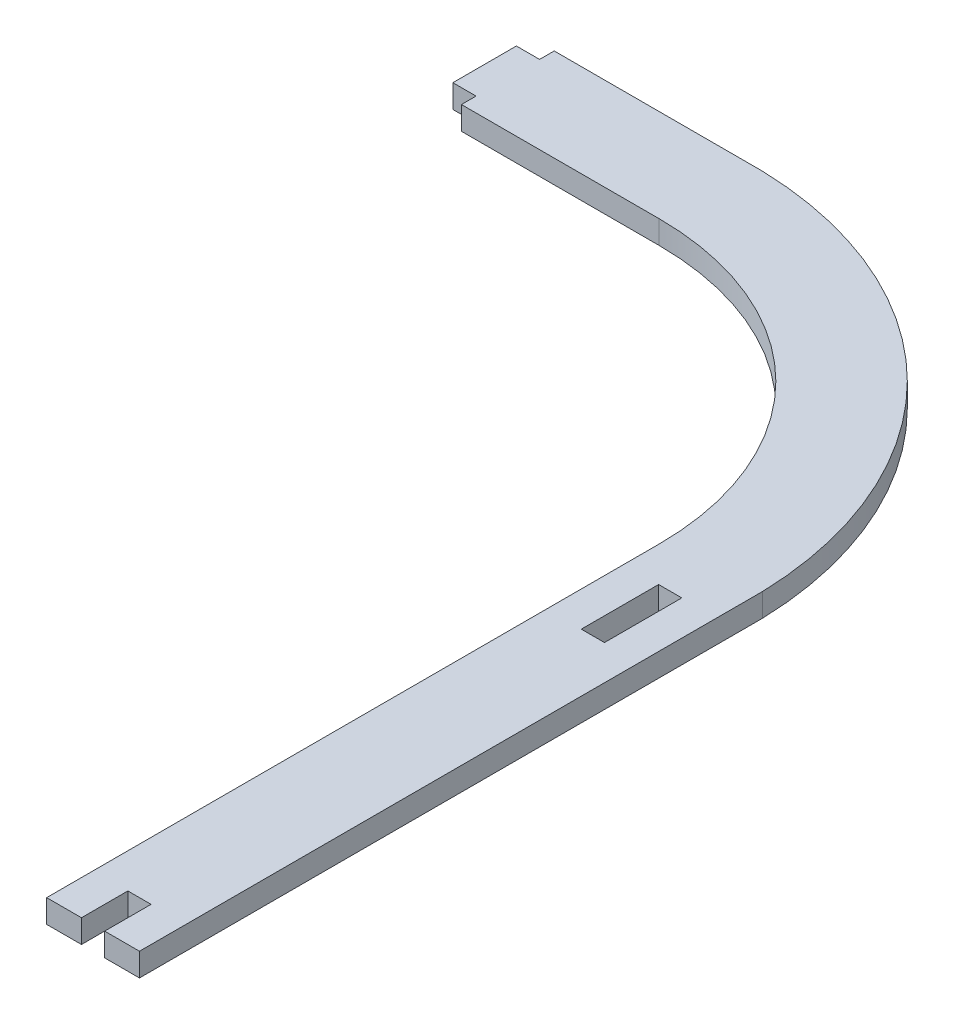
ISO-10303-21;
HEADER;
FILE_DESCRIPTION(('STEP AP214'),'2;1');
FILE_NAME('part.step','',(''),(''),'','','');
FILE_SCHEMA(('AUTOMOTIVE_DESIGN { 1 0 10303 214 1 1 1 1 }'));
ENDSEC;
DATA;
#1=APPLICATION_CONTEXT('core data for automotive mechanical design processes');
#2=APPLICATION_PROTOCOL_DEFINITION('international standard','automotive_design',2000,#1);
#3=PRODUCT_CONTEXT('',#1,'mechanical');
#4=PRODUCT('Part','Part','',(#3));
#5=PRODUCT_RELATED_PRODUCT_CATEGORY('part','',(#4));
#6=PRODUCT_DEFINITION_FORMATION('','',#4);
#7=PRODUCT_DEFINITION_CONTEXT('part definition',#1,'design');
#8=PRODUCT_DEFINITION('design','',#6,#7);
#9=PRODUCT_DEFINITION_SHAPE('','',#8);
#10=(LENGTH_UNIT() NAMED_UNIT(*) SI_UNIT(.MILLI.,.METRE.));
#11=(NAMED_UNIT(*) PLANE_ANGLE_UNIT() SI_UNIT($,.RADIAN.));
#12=(NAMED_UNIT(*) SI_UNIT($,.STERADIAN.) SOLID_ANGLE_UNIT());
#13=UNCERTAINTY_MEASURE_WITH_UNIT(LENGTH_MEASURE(1.E-05),#10,'distance_accuracy_value','');
#14=(GEOMETRIC_REPRESENTATION_CONTEXT(3) GLOBAL_UNCERTAINTY_ASSIGNED_CONTEXT((#13)) GLOBAL_UNIT_ASSIGNED_CONTEXT((#10,
#11,#12)) REPRESENTATION_CONTEXT('',''));
#15=CARTESIAN_POINT('',(0.,0.,0.));
#16=DIRECTION('',(0.,0.,1.));
#17=DIRECTION('',(1.,0.,0.));
#18=AXIS2_PLACEMENT_3D('',#15,#16,#17);
#19=CARTESIAN_POINT('',(77.,3.,0.));
#20=DIRECTION('',(-1.,0.,0.));
#21=DIRECTION('',(0.,0.,1.));
#22=AXIS2_PLACEMENT_3D('',#19,#20,#21);
#23=PLANE('',#22);
#24=DIRECTION('',(0.,0.,-1.));
#25=VECTOR('',#24,1.);
#26=CARTESIAN_POINT('',(77.,0.,0.));
#27=LINE('',#26,#25);
#28=CARTESIAN_POINT('',(77.,0.,117.736951871658));
#29=VERTEX_POINT('',#28);
#30=CARTESIAN_POINT('',(77.,0.,37.1537079258616));
#31=VERTEX_POINT('',#30);
#32=EDGE_CURVE('E219',#29,#31,#27,.T.);
#33=ORIENTED_EDGE('',*,*,#32,.T.);
#34=DIRECTION('',(0.,-1.,0.));
#35=VECTOR('',#34,1.);
#36=CARTESIAN_POINT('',(77.,3.,37.1537079258616));
#37=LINE('',#36,#35);
#38=CARTESIAN_POINT('',(77.,3.,37.1537079258616));
#39=VERTEX_POINT('',#38);
#40=EDGE_CURVE('E11',#39,#31,#37,.T.);
#41=ORIENTED_EDGE('',*,*,#40,.F.);
#42=DIRECTION('',(0.,0.,-1.));
#43=VECTOR('',#42,1.);
#44=CARTESIAN_POINT('',(77.,3.,0.));
#45=LINE('',#44,#43);
#46=CARTESIAN_POINT('',(77.,3.,117.736951871658));
#47=VERTEX_POINT('',#46);
#48=EDGE_CURVE('E313',#47,#39,#45,.T.);
#49=ORIENTED_EDGE('',*,*,#48,.F.);
#50=DIRECTION('',(0.,-1.,0.));
#51=VECTOR('',#50,1.);
#52=CARTESIAN_POINT('',(77.,3.,117.736951871658));
#53=LINE('',#52,#51);
#54=EDGE_CURVE('E262',#47,#29,#53,.T.);
#55=ORIENTED_EDGE('',*,*,#54,.T.);
#56=EDGE_LOOP('',(#33,#41,#49,#55));
#57=FACE_BOUND('',#56,.T.);
#58=ADVANCED_FACE('F35',(#57),#23,.F.);
#59=CARTESIAN_POINT('',(28.5735931288072,3.,38.5333587428506));
#60=DIRECTION('',(0.,-1.,0.));
#61=DIRECTION('',(0.,0.,-1.));
#62=AXIS2_PLACEMENT_3D('',#59,#60,#61);
#63=CYLINDRICAL_SURFACE('',#62,48.4460557613428);
#64=CARTESIAN_POINT('',(28.5735931288072,0.,38.5333587428506));
#65=DIRECTION('',(0.,1.,0.));
#66=DIRECTION('',(0.,0.,1.));
#67=AXIS2_PLACEMENT_3D('',#64,#65,#66);
#68=CIRCLE('',#67,48.4460557613428);
#69=CARTESIAN_POINT('',(29.9532439457968,0.,-9.89304812834225));
#70=VERTEX_POINT('',#69);
#71=EDGE_CURVE('E222',#31,#70,#68,.T.);
#72=ORIENTED_EDGE('',*,*,#71,.T.);
#73=DIRECTION('',(0.,-1.,0.));
#74=VECTOR('',#73,1.);
#75=CARTESIAN_POINT('',(29.9532439457968,3.,-9.89304812834225));
#76=LINE('',#75,#74);
#77=CARTESIAN_POINT('',(29.9532439457968,3.,-9.89304812834225));
#78=VERTEX_POINT('',#77);
#79=EDGE_CURVE('E45',#78,#70,#76,.T.);
#80=ORIENTED_EDGE('',*,*,#79,.F.);
#81=CARTESIAN_POINT('',(28.5735931288072,3.,38.5333587428506));
#82=DIRECTION('',(0.,1.,0.));
#83=DIRECTION('',(0.,0.,1.));
#84=AXIS2_PLACEMENT_3D('',#81,#82,#83);
#85=CIRCLE('',#84,48.4460557613428);
#86=EDGE_CURVE('E316',#39,#78,#85,.T.);
#87=ORIENTED_EDGE('',*,*,#86,.F.);
#88=ORIENTED_EDGE('',*,*,#40,.T.);
#89=EDGE_LOOP('',(#72,#80,#87,#88));
#90=FACE_BOUND('',#89,.T.);
#91=ADVANCED_FACE('F372',(#90),#63,.T.);
#92=CARTESIAN_POINT('',(0.,3.,-9.89304812834225));
#93=DIRECTION('',(0.,0.,-1.));
#94=DIRECTION('',(-1.,0.,0.));
#95=AXIS2_PLACEMENT_3D('',#92,#93,#94);
#96=PLANE('',#95);
#97=DIRECTION('',(1.,0.,0.));
#98=VECTOR('',#97,1.);
#99=CARTESIAN_POINT('',(0.,0.,-9.89304812834225));
#100=LINE('',#99,#98);
#101=CARTESIAN_POINT('',(3.,0.,-9.89304812834225));
#102=VERTEX_POINT('',#101);
#103=EDGE_CURVE('E225',#102,#70,#100,.T.);
#104=ORIENTED_EDGE('',*,*,#103,.F.);
#105=DIRECTION('',(0.,-1.,0.));
#106=VECTOR('',#105,1.);
#107=CARTESIAN_POINT('',(3.,3.,-9.89304812834225));
#108=LINE('',#107,#106);
#109=CARTESIAN_POINT('',(3.,3.,-9.89304812834225));
#110=VERTEX_POINT('',#109);
#111=EDGE_CURVE('E284',#110,#102,#108,.T.);
#112=ORIENTED_EDGE('',*,*,#111,.F.);
#113=DIRECTION('',(1.,0.,0.));
#114=VECTOR('',#113,1.);
#115=CARTESIAN_POINT('',(0.,3.,-9.89304812834225));
#116=LINE('',#115,#114);
#117=EDGE_CURVE('E322',#110,#78,#116,.T.);
#118=ORIENTED_EDGE('',*,*,#117,.T.);
#119=ORIENTED_EDGE('',*,*,#79,.T.);
#120=EDGE_LOOP('',(#104,#112,#118,#119));
#121=FACE_BOUND('',#120,.T.);
#122=ADVANCED_FACE('F377',(#121),#96,.T.);
#123=CARTESIAN_POINT('',(3.,3.,0.));
#124=DIRECTION('',(-1.,0.,0.));
#125=DIRECTION('',(0.,0.,1.));
#126=AXIS2_PLACEMENT_3D('',#123,#124,#125);
#127=PLANE('',#126);
#128=DIRECTION('',(0.,0.,-1.));
#129=VECTOR('',#128,1.);
#130=CARTESIAN_POINT('',(3.,0.,0.));
#131=LINE('',#130,#129);
#132=CARTESIAN_POINT('',(3.,0.,-8.));
#133=VERTEX_POINT('',#132);
#134=EDGE_CURVE('E228',#133,#102,#131,.T.);
#135=ORIENTED_EDGE('',*,*,#134,.F.);
#136=DIRECTION('',(0.,-1.,0.));
#137=VECTOR('',#136,1.);
#138=CARTESIAN_POINT('',(3.,3.,-8.));
#139=LINE('',#138,#137);
#140=CARTESIAN_POINT('',(3.,3.,-8.));
#141=VERTEX_POINT('',#140);
#142=EDGE_CURVE('E282',#141,#133,#139,.T.);
#143=ORIENTED_EDGE('',*,*,#142,.F.);
#144=DIRECTION('',(0.,0.,-1.));
#145=VECTOR('',#144,1.);
#146=CARTESIAN_POINT('',(3.,3.,0.));
#147=LINE('',#146,#145);
#148=EDGE_CURVE('E325',#141,#110,#147,.T.);
#149=ORIENTED_EDGE('',*,*,#148,.T.);
#150=ORIENTED_EDGE('',*,*,#111,.T.);
#151=EDGE_LOOP('',(#135,#143,#149,#150));
#152=FACE_BOUND('',#151,.T.);
#153=ADVANCED_FACE('F426',(#152),#127,.T.);
#154=CARTESIAN_POINT('',(0.,3.,-8.));
#155=DIRECTION('',(0.,0.,-1.));
#156=DIRECTION('',(-1.,0.,0.));
#157=AXIS2_PLACEMENT_3D('',#154,#155,#156);
#158=PLANE('',#157);
#159=DIRECTION('',(1.,0.,0.));
#160=VECTOR('',#159,1.);
#161=CARTESIAN_POINT('',(0.,0.,-8.));
#162=LINE('',#161,#160);
#163=CARTESIAN_POINT('',(0.,0.,-8.));
#164=VERTEX_POINT('',#163);
#165=EDGE_CURVE('E231',#164,#133,#162,.T.);
#166=ORIENTED_EDGE('',*,*,#165,.F.);
#167=DIRECTION('',(0.,-1.,0.));
#168=VECTOR('',#167,1.);
#169=CARTESIAN_POINT('',(0.,3.,-8.));
#170=LINE('',#169,#168);
#171=CARTESIAN_POINT('',(0.,3.,-8.));
#172=VERTEX_POINT('',#171);
#173=EDGE_CURVE('E280',#172,#164,#170,.T.);
#174=ORIENTED_EDGE('',*,*,#173,.F.);
#175=DIRECTION('',(1.,0.,0.));
#176=VECTOR('',#175,1.);
#177=CARTESIAN_POINT('',(0.,3.,-8.));
#178=LINE('',#177,#176);
#179=EDGE_CURVE('E328',#172,#141,#178,.T.);
#180=ORIENTED_EDGE('',*,*,#179,.T.);
#181=ORIENTED_EDGE('',*,*,#142,.T.);
#182=EDGE_LOOP('',(#166,#174,#180,#181));
#183=FACE_BOUND('',#182,.T.);
#184=ADVANCED_FACE('F422',(#183),#158,.T.);
#185=CARTESIAN_POINT('',(0.,3.,0.));
#186=DIRECTION('',(-1.,0.,0.));
#187=DIRECTION('',(0.,0.,1.));
#188=AXIS2_PLACEMENT_3D('',#185,#186,#187);
#189=PLANE('',#188);
#190=DIRECTION('',(0.,0.,-1.));
#191=VECTOR('',#190,1.);
#192=CARTESIAN_POINT('',(0.,0.,0.));
#193=LINE('',#192,#191);
#194=CARTESIAN_POINT('',(0.,0.,0.213903743315501));
#195=VERTEX_POINT('',#194);
#196=EDGE_CURVE('E234',#195,#164,#193,.T.);
#197=ORIENTED_EDGE('',*,*,#196,.F.);
#198=DIRECTION('',(0.,-1.,0.));
#199=VECTOR('',#198,1.);
#200=CARTESIAN_POINT('',(0.,3.,0.213903743315501));
#201=LINE('',#200,#199);
#202=CARTESIAN_POINT('',(0.,3.,0.213903743315501));
#203=VERTEX_POINT('',#202);
#204=EDGE_CURVE('E278',#203,#195,#201,.T.);
#205=ORIENTED_EDGE('',*,*,#204,.F.);
#206=DIRECTION('',(0.,0.,-1.));
#207=VECTOR('',#206,1.);
#208=CARTESIAN_POINT('',(0.,3.,0.));
#209=LINE('',#208,#207);
#210=EDGE_CURVE('E331',#203,#172,#209,.T.);
#211=ORIENTED_EDGE('',*,*,#210,.T.);
#212=ORIENTED_EDGE('',*,*,#173,.T.);
#213=EDGE_LOOP('',(#197,#205,#211,#212));
#214=FACE_BOUND('',#213,.T.);
#215=ADVANCED_FACE('F418',(#214),#189,.T.);
#216=CARTESIAN_POINT('',(0.,3.,0.213903743315501));
#217=DIRECTION('',(0.,0.,-1.));
#218=DIRECTION('',(-1.,0.,0.));
#219=AXIS2_PLACEMENT_3D('',#216,#217,#218);
#220=PLANE('',#219);
#221=DIRECTION('',(1.,0.,0.));
#222=VECTOR('',#221,1.);
#223=CARTESIAN_POINT('',(0.,0.,0.213903743315501));
#224=LINE('',#223,#222);
#225=CARTESIAN_POINT('',(3.,0.,0.213903743315501));
#226=VERTEX_POINT('',#225);
#227=EDGE_CURVE('E237',#195,#226,#224,.T.);
#228=ORIENTED_EDGE('',*,*,#227,.T.);
#229=DIRECTION('',(0.,-1.,0.));
#230=VECTOR('',#229,1.);
#231=CARTESIAN_POINT('',(3.,3.,0.213903743315501));
#232=LINE('',#231,#230);
#233=CARTESIAN_POINT('',(3.,3.,0.213903743315501));
#234=VERTEX_POINT('',#233);
#235=EDGE_CURVE('E276',#234,#226,#232,.T.);
#236=ORIENTED_EDGE('',*,*,#235,.F.);
#237=DIRECTION('',(1.,0.,0.));
#238=VECTOR('',#237,1.);
#239=CARTESIAN_POINT('',(0.,3.,0.213903743315501));
#240=LINE('',#239,#238);
#241=EDGE_CURVE('E334',#203,#234,#240,.T.);
#242=ORIENTED_EDGE('',*,*,#241,.F.);
#243=ORIENTED_EDGE('',*,*,#204,.T.);
#244=EDGE_LOOP('',(#228,#236,#242,#243));
#245=FACE_BOUND('',#244,.T.);
#246=ADVANCED_FACE('F414',(#245),#220,.F.);
#247=CARTESIAN_POINT('',(3.,3.,0.));
#248=DIRECTION('',(-1.,0.,0.));
#249=DIRECTION('',(0.,0.,1.));
#250=AXIS2_PLACEMENT_3D('',#247,#248,#249);
#251=PLANE('',#250);
#252=DIRECTION('',(0.,0.,-1.));
#253=VECTOR('',#252,1.);
#254=CARTESIAN_POINT('',(3.,0.,0.));
#255=LINE('',#254,#253);
#256=CARTESIAN_POINT('',(3.,0.,2.10695187165775));
#257=VERTEX_POINT('',#256);
#258=EDGE_CURVE('E240',#257,#226,#255,.T.);
#259=ORIENTED_EDGE('',*,*,#258,.F.);
#260=DIRECTION('',(0.,-1.,0.));
#261=VECTOR('',#260,1.);
#262=CARTESIAN_POINT('',(3.,3.,2.10695187165775));
#263=LINE('',#262,#261);
#264=CARTESIAN_POINT('',(3.,3.,2.10695187165775));
#265=VERTEX_POINT('',#264);
#266=EDGE_CURVE('E274',#265,#257,#263,.T.);
#267=ORIENTED_EDGE('',*,*,#266,.F.);
#268=DIRECTION('',(0.,0.,-1.));
#269=VECTOR('',#268,1.);
#270=CARTESIAN_POINT('',(3.,3.,0.));
#271=LINE('',#270,#269);
#272=EDGE_CURVE('E336',#265,#234,#271,.T.);
#273=ORIENTED_EDGE('',*,*,#272,.T.);
#274=ORIENTED_EDGE('',*,*,#235,.T.);
#275=EDGE_LOOP('',(#259,#267,#273,#274));
#276=FACE_BOUND('',#275,.T.);
#277=ADVANCED_FACE('F410',(#276),#251,.T.);
#278=CARTESIAN_POINT('',(0.,3.,2.10695187165775));
#279=DIRECTION('',(0.,0.,-1.));
#280=DIRECTION('',(-1.,0.,0.));
#281=AXIS2_PLACEMENT_3D('',#278,#279,#280);
#282=PLANE('',#281);
#283=DIRECTION('',(1.,0.,0.));
#284=VECTOR('',#283,1.);
#285=CARTESIAN_POINT('',(0.,0.,2.10695187165775));
#286=LINE('',#285,#284);
#287=CARTESIAN_POINT('',(28.5735931288072,0.,2.10695187165775));
#288=VERTEX_POINT('',#287);
#289=EDGE_CURVE('E243',#257,#288,#286,.T.);
#290=ORIENTED_EDGE('',*,*,#289,.T.);
#291=DIRECTION('',(0.,-1.,0.));
#292=VECTOR('',#291,1.);
#293=CARTESIAN_POINT('',(28.5735931288072,3.,2.10695187165775));
#294=LINE('',#293,#292);
#295=CARTESIAN_POINT('',(28.5735931288072,3.,2.10695187165775));
#296=VERTEX_POINT('',#295);
#297=EDGE_CURVE('E272',#296,#288,#294,.T.);
#298=ORIENTED_EDGE('',*,*,#297,.F.);
#299=DIRECTION('',(1.,0.,0.));
#300=VECTOR('',#299,1.);
#301=CARTESIAN_POINT('',(0.,3.,2.10695187165775));
#302=LINE('',#301,#300);
#303=EDGE_CURVE('E339',#265,#296,#302,.T.);
#304=ORIENTED_EDGE('',*,*,#303,.F.);
#305=ORIENTED_EDGE('',*,*,#266,.T.);
#306=EDGE_LOOP('',(#290,#298,#304,#305));
#307=FACE_BOUND('',#306,.T.);
#308=ADVANCED_FACE('F406',(#307),#282,.F.);
#309=CARTESIAN_POINT('',(28.5735931288072,3.,38.5333587428506));
#310=DIRECTION('',(0.,-1.,0.));
#311=DIRECTION('',(0.,0.,-1.));
#312=AXIS2_PLACEMENT_3D('',#309,#310,#311);
#313=CYLINDRICAL_SURFACE('',#312,36.4264068711928);
#314=CARTESIAN_POINT('',(28.5735931288072,0.,38.5333587428506));
#315=DIRECTION('',(0.,1.,0.));
#316=DIRECTION('',(0.,0.,1.));
#317=AXIS2_PLACEMENT_3D('',#314,#315,#316);
#318=CIRCLE('',#317,36.4264068711928);
#319=CARTESIAN_POINT('',(65.,0.,38.5333587428506));
#320=VERTEX_POINT('',#319);
#321=EDGE_CURVE('E246',#320,#288,#318,.T.);
#322=ORIENTED_EDGE('',*,*,#321,.F.);
#323=DIRECTION('',(0.,-1.,0.));
#324=VECTOR('',#323,1.);
#325=CARTESIAN_POINT('',(65.,3.,38.5333587428506));
#326=LINE('',#325,#324);
#327=CARTESIAN_POINT('',(65.,3.,38.5333587428506));
#328=VERTEX_POINT('',#327);
#329=EDGE_CURVE('E270',#328,#320,#326,.T.);
#330=ORIENTED_EDGE('',*,*,#329,.F.);
#331=CARTESIAN_POINT('',(28.5735931288072,3.,38.5333587428506));
#332=DIRECTION('',(0.,1.,0.));
#333=DIRECTION('',(0.,0.,1.));
#334=AXIS2_PLACEMENT_3D('',#331,#332,#333);
#335=CIRCLE('',#334,36.4264068711928);
#336=EDGE_CURVE('E341',#328,#296,#335,.T.);
#337=ORIENTED_EDGE('',*,*,#336,.T.);
#338=ORIENTED_EDGE('',*,*,#297,.T.);
#339=EDGE_LOOP('',(#322,#330,#337,#338));
#340=FACE_BOUND('',#339,.T.);
#341=ADVANCED_FACE('F402',(#340),#313,.F.);
#342=CARTESIAN_POINT('',(65.,3.,0.));
#343=DIRECTION('',(-1.,0.,0.));
#344=DIRECTION('',(0.,0.,1.));
#345=AXIS2_PLACEMENT_3D('',#342,#343,#344);
#346=PLANE('',#345);
#347=DIRECTION('',(0.,0.,-1.));
#348=VECTOR('',#347,1.);
#349=CARTESIAN_POINT('',(65.,0.,0.));
#350=LINE('',#349,#348);
#351=CARTESIAN_POINT('',(65.,0.,117.736951871658));
#352=VERTEX_POINT('',#351);
#353=EDGE_CURVE('E249',#352,#320,#350,.T.);
#354=ORIENTED_EDGE('',*,*,#353,.F.);
#355=DIRECTION('',(0.,-1.,0.));
#356=VECTOR('',#355,1.);
#357=CARTESIAN_POINT('',(65.,3.,117.736951871658));
#358=LINE('',#357,#356);
#359=CARTESIAN_POINT('',(65.,3.,117.736951871658));
#360=VERTEX_POINT('',#359);
#361=EDGE_CURVE('E268',#360,#352,#358,.T.);
#362=ORIENTED_EDGE('',*,*,#361,.F.);
#363=DIRECTION('',(0.,0.,-1.));
#364=VECTOR('',#363,1.);
#365=CARTESIAN_POINT('',(65.,3.,0.));
#366=LINE('',#365,#364);
#367=EDGE_CURVE('E344',#360,#328,#366,.T.);
#368=ORIENTED_EDGE('',*,*,#367,.T.);
#369=ORIENTED_EDGE('',*,*,#329,.T.);
#370=EDGE_LOOP('',(#354,#362,#368,#369));
#371=FACE_BOUND('',#370,.T.);
#372=ADVANCED_FACE('F399',(#371),#346,.T.);
#373=CARTESIAN_POINT('',(0.,3.,117.736951871658));
#374=DIRECTION('',(0.,0.,1.));
#375=DIRECTION('',(1.,0.,0.));
#376=AXIS2_PLACEMENT_3D('',#373,#374,#375);
#377=PLANE('',#376);
#378=DIRECTION('',(-1.,0.,0.));
#379=VECTOR('',#378,1.);
#380=CARTESIAN_POINT('',(0.,0.,117.736951871658));
#381=LINE('',#380,#379);
#382=CARTESIAN_POINT('',(69.5,0.,117.736951871658));
#383=VERTEX_POINT('',#382);
#384=EDGE_CURVE('E252',#383,#352,#381,.T.);
#385=ORIENTED_EDGE('',*,*,#384,.F.);
#386=DIRECTION('',(0.,-1.,0.));
#387=VECTOR('',#386,1.);
#388=CARTESIAN_POINT('',(69.5,3.,117.736951871658));
#389=LINE('',#388,#387);
#390=CARTESIAN_POINT('',(69.5,3.,117.736951871658));
#391=VERTEX_POINT('',#390);
#392=EDGE_CURVE('E266',#391,#383,#389,.T.);
#393=ORIENTED_EDGE('',*,*,#392,.F.);
#394=DIRECTION('',(-1.,0.,0.));
#395=VECTOR('',#394,1.);
#396=CARTESIAN_POINT('',(0.,3.,117.736951871658));
#397=LINE('',#396,#395);
#398=EDGE_CURVE('E204',#391,#360,#397,.T.);
#399=ORIENTED_EDGE('',*,*,#398,.T.);
#400=ORIENTED_EDGE('',*,*,#361,.T.);
#401=EDGE_LOOP('',(#385,#393,#399,#400));
#402=FACE_BOUND('',#401,.T.);
#403=ADVANCED_FACE('F349',(#402),#377,.T.);
#404=CARTESIAN_POINT('',(69.5,3.,0.));
#405=DIRECTION('',(1.,0.,0.));
#406=DIRECTION('',(0.,0.,-1.));
#407=AXIS2_PLACEMENT_3D('',#404,#405,#406);
#408=PLANE('',#407);
#409=DIRECTION('',(0.,0.,1.));
#410=VECTOR('',#409,1.);
#411=CARTESIAN_POINT('',(69.5,0.,0.));
#412=LINE('',#411,#410);
#413=CARTESIAN_POINT('',(69.5,0.,111.736951871658));
#414=VERTEX_POINT('',#413);
#415=EDGE_CURVE('E255',#414,#383,#412,.T.);
#416=ORIENTED_EDGE('',*,*,#415,.F.);
#417=DIRECTION('',(0.,-1.,0.));
#418=VECTOR('',#417,1.);
#419=CARTESIAN_POINT('',(69.5,3.,111.736951871658));
#420=LINE('',#419,#418);
#421=CARTESIAN_POINT('',(69.5,3.,111.736951871658));
#422=VERTEX_POINT('',#421);
#423=EDGE_CURVE('E192',#422,#414,#420,.T.);
#424=ORIENTED_EDGE('',*,*,#423,.F.);
#425=DIRECTION('',(0.,0.,1.));
#426=VECTOR('',#425,1.);
#427=CARTESIAN_POINT('',(69.5,3.,0.));
#428=LINE('',#427,#426);
#429=EDGE_CURVE('E202',#422,#391,#428,.T.);
#430=ORIENTED_EDGE('',*,*,#429,.T.);
#431=ORIENTED_EDGE('',*,*,#392,.T.);
#432=EDGE_LOOP('',(#416,#424,#430,#431));
#433=FACE_BOUND('',#432,.T.);
#434=ADVANCED_FACE('F355',(#433),#408,.T.);
#435=CARTESIAN_POINT('',(0.,3.,111.736951871658));
#436=DIRECTION('',(0.,0.,1.));
#437=DIRECTION('',(1.,0.,0.));
#438=AXIS2_PLACEMENT_3D('',#435,#436,#437);
#439=PLANE('',#438);
#440=DIRECTION('',(-1.,0.,0.));
#441=VECTOR('',#440,1.);
#442=CARTESIAN_POINT('',(0.,0.,111.736951871658));
#443=LINE('',#442,#441);
#444=CARTESIAN_POINT('',(72.5,0.,111.736951871658));
#445=VERTEX_POINT('',#444);
#446=EDGE_CURVE('E191',#445,#414,#443,.T.);
#447=ORIENTED_EDGE('',*,*,#446,.F.);
#448=DIRECTION('',(0.,-1.,0.));
#449=VECTOR('',#448,1.);
#450=CARTESIAN_POINT('',(72.5,3.,111.736951871658));
#451=LINE('',#450,#449);
#452=CARTESIAN_POINT('',(72.5,3.,111.736951871658));
#453=VERTEX_POINT('',#452);
#454=EDGE_CURVE('E185',#453,#445,#451,.T.);
#455=ORIENTED_EDGE('',*,*,#454,.F.);
#456=DIRECTION('',(-1.,0.,0.));
#457=VECTOR('',#456,1.);
#458=CARTESIAN_POINT('',(0.,3.,111.736951871658));
#459=LINE('',#458,#457);
#460=EDGE_CURVE('E189',#453,#422,#459,.T.);
#461=ORIENTED_EDGE('',*,*,#460,.T.);
#462=ORIENTED_EDGE('',*,*,#423,.T.);
#463=EDGE_LOOP('',(#447,#455,#461,#462));
#464=FACE_BOUND('',#463,.T.);
#465=ADVANCED_FACE('F187',(#464),#439,.T.);
#466=CARTESIAN_POINT('',(72.5,3.,0.));
#467=DIRECTION('',(1.,0.,0.));
#468=DIRECTION('',(0.,0.,-1.));
#469=AXIS2_PLACEMENT_3D('',#466,#467,#468);
#470=PLANE('',#469);
#471=DIRECTION('',(0.,0.,1.));
#472=VECTOR('',#471,1.);
#473=CARTESIAN_POINT('',(72.5,0.,0.));
#474=LINE('',#473,#472);
#475=CARTESIAN_POINT('',(72.5,0.,117.736951871658));
#476=VERTEX_POINT('',#475);
#477=EDGE_CURVE('E118',#445,#476,#474,.T.);
#478=ORIENTED_EDGE('',*,*,#477,.T.);
#479=DIRECTION('',(0.,-1.,0.));
#480=VECTOR('',#479,1.);
#481=CARTESIAN_POINT('',(72.5,3.,117.736951871658));
#482=LINE('',#481,#480);
#483=CARTESIAN_POINT('',(72.5,3.,117.736951871658));
#484=VERTEX_POINT('',#483);
#485=EDGE_CURVE('E193',#484,#476,#482,.T.);
#486=ORIENTED_EDGE('',*,*,#485,.F.);
#487=DIRECTION('',(0.,0.,1.));
#488=VECTOR('',#487,1.);
#489=CARTESIAN_POINT('',(72.5,3.,0.));
#490=LINE('',#489,#488);
#491=EDGE_CURVE('E195',#453,#484,#490,.T.);
#492=ORIENTED_EDGE('',*,*,#491,.F.);
#493=ORIENTED_EDGE('',*,*,#454,.T.);
#494=EDGE_LOOP('',(#478,#486,#492,#493));
#495=FACE_BOUND('',#494,.T.);
#496=ADVANCED_FACE('F196',(#495),#470,.F.);
#497=CARTESIAN_POINT('',(0.,3.,53.1069518716578));
#498=DIRECTION('',(0.,0.,1.));
#499=DIRECTION('',(1.,0.,0.));
#500=AXIS2_PLACEMENT_3D('',#497,#498,#499);
#501=PLANE('',#500);
#502=DIRECTION('',(-1.,0.,0.));
#503=VECTOR('',#502,1.);
#504=CARTESIAN_POINT('',(0.,0.,53.1069518716578));
#505=LINE('',#504,#503);
#506=CARTESIAN_POINT('',(72.5,0.,53.1069518716578));
#507=VERTEX_POINT('',#506);
#508=CARTESIAN_POINT('',(69.5,0.,53.1069518716578));
#509=VERTEX_POINT('',#508);
#510=EDGE_CURVE('E210',#507,#509,#505,.T.);
#511=ORIENTED_EDGE('',*,*,#510,.T.);
#512=DIRECTION('',(0.,-1.,0.));
#513=VECTOR('',#512,1.);
#514=CARTESIAN_POINT('',(69.5,3.,53.1069518716578));
#515=LINE('',#514,#513);
#516=CARTESIAN_POINT('',(69.5,3.,53.1069518716578));
#517=VERTEX_POINT('',#516);
#518=EDGE_CURVE('E39',#517,#509,#515,.T.);
#519=ORIENTED_EDGE('',*,*,#518,.F.);
#520=DIRECTION('',(-1.,0.,0.));
#521=VECTOR('',#520,1.);
#522=CARTESIAN_POINT('',(0.,3.,53.1069518716578));
#523=LINE('',#522,#521);
#524=CARTESIAN_POINT('',(72.5,3.,53.1069518716578));
#525=VERTEX_POINT('',#524);
#526=EDGE_CURVE('E261',#525,#517,#523,.T.);
#527=ORIENTED_EDGE('',*,*,#526,.F.);
#528=DIRECTION('',(0.,-1.,0.));
#529=VECTOR('',#528,1.);
#530=CARTESIAN_POINT('',(72.5,3.,53.1069518716578));
#531=LINE('',#530,#529);
#532=EDGE_CURVE('E209',#525,#507,#531,.T.);
#533=ORIENTED_EDGE('',*,*,#532,.T.);
#534=EDGE_LOOP('',(#511,#519,#527,#533));
#535=FACE_BOUND('',#534,.T.);
#536=ADVANCED_FACE('F37',(#535),#501,.F.);
#537=CARTESIAN_POINT('',(69.5,3.,0.));
#538=DIRECTION('',(-1.,0.,0.));
#539=DIRECTION('',(0.,0.,1.));
#540=AXIS2_PLACEMENT_3D('',#537,#538,#539);
#541=PLANE('',#540);
#542=DIRECTION('',(0.,0.,-1.));
#543=VECTOR('',#542,1.);
#544=CARTESIAN_POINT('',(69.5,0.,0.));
#545=LINE('',#544,#543);
#546=CARTESIAN_POINT('',(69.5,0.,43.1069518716578));
#547=VERTEX_POINT('',#546);
#548=EDGE_CURVE('E213',#509,#547,#545,.T.);
#549=ORIENTED_EDGE('',*,*,#548,.T.);
#550=DIRECTION('',(0.,-1.,0.));
#551=VECTOR('',#550,1.);
#552=CARTESIAN_POINT('',(69.5,3.,43.1069518716578));
#553=LINE('',#552,#551);
#554=CARTESIAN_POINT('',(69.5,3.,43.1069518716578));
#555=VERTEX_POINT('',#554);
#556=EDGE_CURVE('E291',#555,#547,#553,.T.);
#557=ORIENTED_EDGE('',*,*,#556,.F.);
#558=DIRECTION('',(0.,0.,-1.));
#559=VECTOR('',#558,1.);
#560=CARTESIAN_POINT('',(69.5,3.,0.));
#561=LINE('',#560,#559);
#562=EDGE_CURVE('E133',#517,#555,#561,.T.);
#563=ORIENTED_EDGE('',*,*,#562,.F.);
#564=ORIENTED_EDGE('',*,*,#518,.T.);
#565=EDGE_LOOP('',(#549,#557,#563,#564));
#566=FACE_BOUND('',#565,.T.);
#567=ADVANCED_FACE('F297',(#566),#541,.F.);
#568=CARTESIAN_POINT('',(0.,3.,43.1069518716578));
#569=DIRECTION('',(0.,0.,-1.));
#570=DIRECTION('',(-1.,0.,0.));
#571=AXIS2_PLACEMENT_3D('',#568,#569,#570);
#572=PLANE('',#571);
#573=DIRECTION('',(1.,0.,0.));
#574=VECTOR('',#573,1.);
#575=CARTESIAN_POINT('',(0.,0.,43.1069518716578));
#576=LINE('',#575,#574);
#577=CARTESIAN_POINT('',(72.5,0.,43.1069518716578));
#578=VERTEX_POINT('',#577);
#579=EDGE_CURVE('E215',#547,#578,#576,.T.);
#580=ORIENTED_EDGE('',*,*,#579,.T.);
#581=DIRECTION('',(0.,-1.,0.));
#582=VECTOR('',#581,1.);
#583=CARTESIAN_POINT('',(72.5,3.,43.1069518716578));
#584=LINE('',#583,#582);
#585=CARTESIAN_POINT('',(72.5,3.,43.1069518716578));
#586=VERTEX_POINT('',#585);
#587=EDGE_CURVE('E289',#586,#578,#584,.T.);
#588=ORIENTED_EDGE('',*,*,#587,.F.);
#589=DIRECTION('',(1.,0.,0.));
#590=VECTOR('',#589,1.);
#591=CARTESIAN_POINT('',(0.,3.,43.1069518716578));
#592=LINE('',#591,#590);
#593=EDGE_CURVE('E314',#555,#586,#592,.T.);
#594=ORIENTED_EDGE('',*,*,#593,.F.);
#595=ORIENTED_EDGE('',*,*,#556,.T.);
#596=EDGE_LOOP('',(#580,#588,#594,#595));
#597=FACE_BOUND('',#596,.T.);
#598=ADVANCED_FACE('F307',(#597),#572,.F.);
#599=CARTESIAN_POINT('',(72.5,3.,-1.00613961606655E-13));
#600=DIRECTION('',(1.,0.,0.));
#601=DIRECTION('',(0.,0.,-1.));
#602=AXIS2_PLACEMENT_3D('',#599,#600,#601);
#603=PLANE('',#602);
#604=DIRECTION('',(0.,0.,1.));
#605=VECTOR('',#604,1.);
#606=CARTESIAN_POINT('',(72.5,0.,-1.00613961606655E-13));
#607=LINE('',#606,#605);
#608=EDGE_CURVE('E217',#578,#507,#607,.T.);
#609=ORIENTED_EDGE('',*,*,#608,.T.);
#610=ORIENTED_EDGE('',*,*,#532,.F.);
#611=DIRECTION('',(0.,0.,1.));
#612=VECTOR('',#611,1.);
#613=CARTESIAN_POINT('',(72.5,3.,-1.00613961606655E-13));
#614=LINE('',#613,#612);
#615=EDGE_CURVE('E311',#586,#525,#614,.T.);
#616=ORIENTED_EDGE('',*,*,#615,.F.);
#617=ORIENTED_EDGE('',*,*,#587,.T.);
#618=EDGE_LOOP('',(#609,#610,#616,#617));
#619=FACE_BOUND('',#618,.T.);
#620=ADVANCED_FACE('F310',(#619),#603,.F.);
#621=CARTESIAN_POINT('',(0.,3.,117.736951871658));
#622=DIRECTION('',(0.,0.,-1.));
#623=DIRECTION('',(-1.,0.,0.));
#624=AXIS2_PLACEMENT_3D('',#621,#622,#623);
#625=PLANE('',#624);
#626=DIRECTION('',(1.,0.,0.));
#627=VECTOR('',#626,1.);
#628=CARTESIAN_POINT('',(0.,0.,117.736951871658));
#629=LINE('',#628,#627);
#630=EDGE_CURVE('E124',#476,#29,#629,.T.);
#631=ORIENTED_EDGE('',*,*,#630,.T.);
#632=ORIENTED_EDGE('',*,*,#54,.F.);
#633=DIRECTION('',(1.,0.,0.));
#634=VECTOR('',#633,1.);
#635=CARTESIAN_POINT('',(0.,3.,117.736951871658));
#636=LINE('',#635,#634);
#637=EDGE_CURVE('E54',#484,#47,#636,.T.);
#638=ORIENTED_EDGE('',*,*,#637,.F.);
#639=ORIENTED_EDGE('',*,*,#485,.T.);
#640=EDGE_LOOP('',(#631,#632,#638,#639));
#641=FACE_BOUND('',#640,.T.);
#642=ADVANCED_FACE('F360',(#641),#625,.F.);
#643=CARTESIAN_POINT('',(0.,3.,0.));
#644=DIRECTION('',(0.,1.,0.));
#645=DIRECTION('',(0.,0.,1.));
#646=AXIS2_PLACEMENT_3D('',#643,#644,#645);
#647=PLANE('',#646);
#648=ORIENTED_EDGE('',*,*,#526,.T.);
#649=ORIENTED_EDGE('',*,*,#562,.T.);
#650=ORIENTED_EDGE('',*,*,#593,.T.);
#651=ORIENTED_EDGE('',*,*,#615,.T.);
#652=EDGE_LOOP('',(#648,#649,#650,#651));
#653=FACE_BOUND('',#652,.T.);
#654=ORIENTED_EDGE('',*,*,#48,.T.);
#655=ORIENTED_EDGE('',*,*,#86,.T.);
#656=ORIENTED_EDGE('',*,*,#117,.F.);
#657=ORIENTED_EDGE('',*,*,#148,.F.);
#658=ORIENTED_EDGE('',*,*,#179,.F.);
#659=ORIENTED_EDGE('',*,*,#210,.F.);
#660=ORIENTED_EDGE('',*,*,#241,.T.);
#661=ORIENTED_EDGE('',*,*,#272,.F.);
#662=ORIENTED_EDGE('',*,*,#303,.T.);
#663=ORIENTED_EDGE('',*,*,#336,.F.);
#664=ORIENTED_EDGE('',*,*,#367,.F.);
#665=ORIENTED_EDGE('',*,*,#398,.F.);
#666=ORIENTED_EDGE('',*,*,#429,.F.);
#667=ORIENTED_EDGE('',*,*,#460,.F.);
#668=ORIENTED_EDGE('',*,*,#491,.T.);
#669=ORIENTED_EDGE('',*,*,#637,.T.);
#670=EDGE_LOOP('',(#654,#655,#656,#657,#658,#659,#660,#661,#662,#663,#664,#665,#666,#667,#668,#669));
#671=FACE_BOUND('',#670,.T.);
#672=ADVANCED_FACE('F199',(#653,#671),#647,.T.);
#673=CARTESIAN_POINT('',(0.,0.,0.));
#674=DIRECTION('',(0.,1.,0.));
#675=DIRECTION('',(0.,0.,1.));
#676=AXIS2_PLACEMENT_3D('',#673,#674,#675);
#677=PLANE('',#676);
#678=ORIENTED_EDGE('',*,*,#510,.F.);
#679=ORIENTED_EDGE('',*,*,#608,.F.);
#680=ORIENTED_EDGE('',*,*,#579,.F.);
#681=ORIENTED_EDGE('',*,*,#548,.F.);
#682=EDGE_LOOP('',(#678,#679,#680,#681));
#683=FACE_BOUND('',#682,.T.);
#684=ORIENTED_EDGE('',*,*,#32,.F.);
#685=ORIENTED_EDGE('',*,*,#630,.F.);
#686=ORIENTED_EDGE('',*,*,#477,.F.);
#687=ORIENTED_EDGE('',*,*,#446,.T.);
#688=ORIENTED_EDGE('',*,*,#415,.T.);
#689=ORIENTED_EDGE('',*,*,#384,.T.);
#690=ORIENTED_EDGE('',*,*,#353,.T.);
#691=ORIENTED_EDGE('',*,*,#321,.T.);
#692=ORIENTED_EDGE('',*,*,#289,.F.);
#693=ORIENTED_EDGE('',*,*,#258,.T.);
#694=ORIENTED_EDGE('',*,*,#227,.F.);
#695=ORIENTED_EDGE('',*,*,#196,.T.);
#696=ORIENTED_EDGE('',*,*,#165,.T.);
#697=ORIENTED_EDGE('',*,*,#134,.T.);
#698=ORIENTED_EDGE('',*,*,#103,.T.);
#699=ORIENTED_EDGE('',*,*,#71,.F.);
#700=EDGE_LOOP('',(#684,#685,#686,#687,#688,#689,#690,#691,#692,#693,#694,#695,#696,#697,#698,#699));
#701=FACE_BOUND('',#700,.T.);
#702=ADVANCED_FACE('F304',(#683,#701),#677,.F.);
#703=CLOSED_SHELL('',(#58,#91,#122,#153,#184,#215,#246,#277,#308,#341,#372,#403,#434,#465,#496,
#536,#567,#598,#620,#642,#672,#702));
#704=MANIFOLD_SOLID_BREP('B2',#703);
#705=ADVANCED_BREP_SHAPE_REPRESENTATION('',(#18,#704),#14);
#706=SHAPE_DEFINITION_REPRESENTATION(#9,#705);
ENDSEC;
END-ISO-10303-21;
